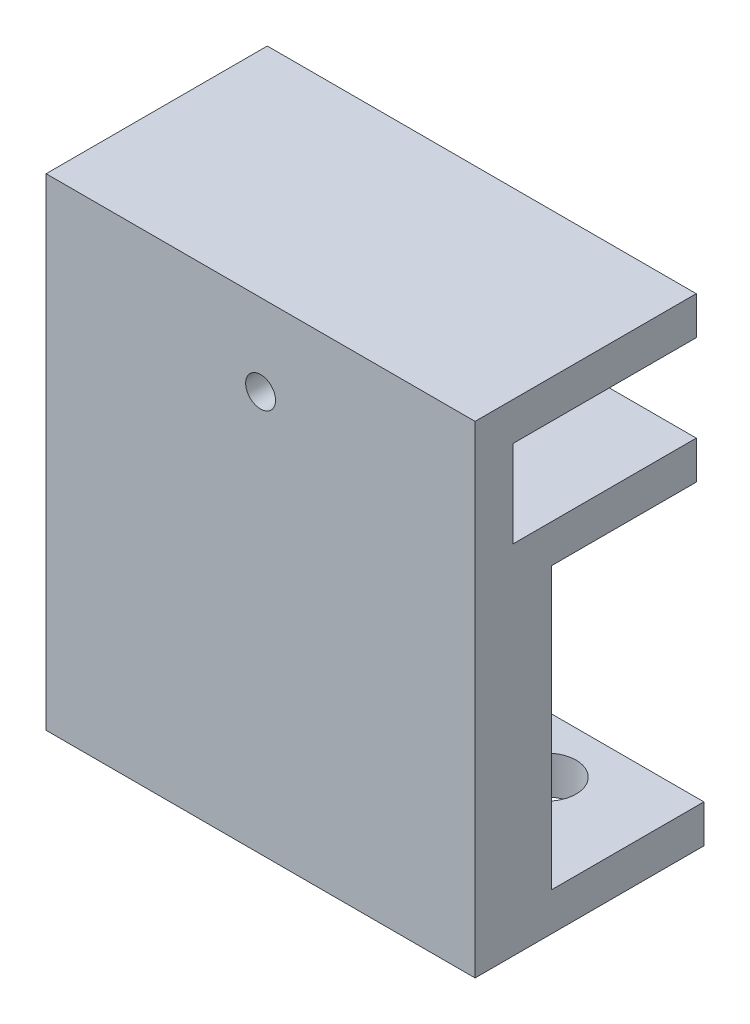
ISO-10303-21;
HEADER;
FILE_DESCRIPTION(('STEP AP214'),'2;1');
FILE_NAME('part.step','',(''),(''),'','','');
FILE_SCHEMA(('AUTOMOTIVE_DESIGN { 1 0 10303 214 1 1 1 1 }'));
ENDSEC;
DATA;
#1=APPLICATION_CONTEXT('core data for automotive mechanical design processes');
#2=APPLICATION_PROTOCOL_DEFINITION('international standard','automotive_design',2000,#1);
#3=PRODUCT_CONTEXT('',#1,'mechanical');
#4=PRODUCT('Part','Part','',(#3));
#5=PRODUCT_RELATED_PRODUCT_CATEGORY('part','',(#4));
#6=PRODUCT_DEFINITION_FORMATION('','',#4);
#7=PRODUCT_DEFINITION_CONTEXT('part definition',#1,'design');
#8=PRODUCT_DEFINITION('design','',#6,#7);
#9=PRODUCT_DEFINITION_SHAPE('','',#8);
#10=(LENGTH_UNIT() NAMED_UNIT(*) SI_UNIT(.MILLI.,.METRE.));
#11=(NAMED_UNIT(*) PLANE_ANGLE_UNIT() SI_UNIT($,.RADIAN.));
#12=(NAMED_UNIT(*) SI_UNIT($,.STERADIAN.) SOLID_ANGLE_UNIT());
#13=UNCERTAINTY_MEASURE_WITH_UNIT(LENGTH_MEASURE(1.E-05),#10,'distance_accuracy_value','');
#14=(GEOMETRIC_REPRESENTATION_CONTEXT(3) GLOBAL_UNCERTAINTY_ASSIGNED_CONTEXT((#13)) GLOBAL_UNIT_ASSIGNED_CONTEXT((#10,
#11,#12)) REPRESENTATION_CONTEXT('',''));
#15=CARTESIAN_POINT('',(0.,0.,0.));
#16=DIRECTION('',(0.,0.,1.));
#17=DIRECTION('',(1.,0.,0.));
#18=AXIS2_PLACEMENT_3D('',#15,#16,#17);
#19=CARTESIAN_POINT('',(35.7124,20.828,-24.13));
#20=DIRECTION('',(0.,0.,1.));
#21=DIRECTION('',(1.,0.,0.));
#22=AXIS2_PLACEMENT_3D('',#19,#20,#21);
#23=PLANE('',#22);
#24=DIRECTION('',(0.,1.,0.));
#25=VECTOR('',#24,1.);
#26=CARTESIAN_POINT('',(-35.7124,20.828,-24.13));
#27=LINE('',#26,#25);
#28=CARTESIAN_POINT('',(-35.7124,20.828,-24.13));
#29=VERTEX_POINT('',#28);
#30=CARTESIAN_POINT('',(-35.7124,27.178,-24.13));
#31=VERTEX_POINT('',#30);
#32=EDGE_CURVE('E164',#29,#31,#27,.T.);
#33=ORIENTED_EDGE('',*,*,#32,.T.);
#34=DIRECTION('',(-1.,0.,0.));
#35=VECTOR('',#34,1.);
#36=CARTESIAN_POINT('',(35.7124,27.178,-24.13));
#37=LINE('',#36,#35);
#38=CARTESIAN_POINT('',(35.7124,27.178,-24.13));
#39=VERTEX_POINT('',#38);
#40=EDGE_CURVE('E11',#39,#31,#37,.T.);
#41=ORIENTED_EDGE('',*,*,#40,.F.);
#42=DIRECTION('',(0.,1.,0.));
#43=VECTOR('',#42,1.);
#44=CARTESIAN_POINT('',(35.7124,20.828,-24.13));
#45=LINE('',#44,#43);
#46=CARTESIAN_POINT('',(35.7124,20.828,-24.13));
#47=VERTEX_POINT('',#46);
#48=EDGE_CURVE('E200',#47,#39,#45,.T.);
#49=ORIENTED_EDGE('',*,*,#48,.F.);
#50=DIRECTION('',(-1.,0.,0.));
#51=VECTOR('',#50,1.);
#52=CARTESIAN_POINT('',(35.7124,20.828,-24.13));
#53=LINE('',#52,#51);
#54=EDGE_CURVE('E160',#47,#29,#53,.T.);
#55=ORIENTED_EDGE('',*,*,#54,.T.);
#56=EDGE_LOOP('',(#33,#41,#49,#55));
#57=FACE_BOUND('',#56,.T.);
#58=ADVANCED_FACE('F39',(#57),#23,.F.);
#59=CARTESIAN_POINT('',(35.7124,27.178,-24.13));
#60=DIRECTION('',(0.,-1.,0.));
#61=DIRECTION('',(0.,0.,-1.));
#62=AXIS2_PLACEMENT_3D('',#59,#60,#61);
#63=PLANE('',#62);
#64=DIRECTION('',(0.,0.,1.));
#65=VECTOR('',#64,1.);
#66=CARTESIAN_POINT('',(-35.7124,27.178,-24.13));
#67=LINE('',#66,#65);
#68=CARTESIAN_POINT('',(-35.7124,27.178,12.7));
#69=VERTEX_POINT('',#68);
#70=EDGE_CURVE('E168',#31,#69,#67,.T.);
#71=ORIENTED_EDGE('',*,*,#70,.T.);
#72=DIRECTION('',(-1.,0.,0.));
#73=VECTOR('',#72,1.);
#74=CARTESIAN_POINT('',(35.7124,27.178,12.7));
#75=LINE('',#74,#73);
#76=CARTESIAN_POINT('',(35.7124,27.178,12.7));
#77=VERTEX_POINT('',#76);
#78=EDGE_CURVE('E48',#77,#69,#75,.T.);
#79=ORIENTED_EDGE('',*,*,#78,.F.);
#80=DIRECTION('',(0.,0.,1.));
#81=VECTOR('',#80,1.);
#82=CARTESIAN_POINT('',(35.7124,27.178,-24.13));
#83=LINE('',#82,#81);
#84=EDGE_CURVE('E111',#39,#77,#83,.T.);
#85=ORIENTED_EDGE('',*,*,#84,.F.);
#86=ORIENTED_EDGE('',*,*,#40,.T.);
#87=EDGE_LOOP('',(#71,#79,#85,#86));
#88=FACE_BOUND('',#87,.T.);
#89=ADVANCED_FACE('F237',(#88),#63,.F.);
#90=CARTESIAN_POINT('',(35.7124,0.,12.7));
#91=DIRECTION('',(0.,0.,-1.));
#92=DIRECTION('',(0.,1.,0.));
#93=AXIS2_PLACEMENT_3D('',#90,#91,#92);
#94=PLANE('',#93);
#95=CARTESIAN_POINT('',(0.,13.589,12.7));
#96=DIRECTION('',(0.,0.,1.));
#97=DIRECTION('',(1.,0.,0.));
#98=AXIS2_PLACEMENT_3D('',#95,#96,#97);
#99=CIRCLE('',#98,2.4892);
#100=CARTESIAN_POINT('',(2.4892,13.589,12.7));
#101=VERTEX_POINT('',#100);
#102=EDGE_CURVE('E413',#101,#101,#99,.T.);
#103=ORIENTED_EDGE('',*,*,#102,.F.);
#104=EDGE_LOOP('',(#103));
#105=FACE_BOUND('',#104,.T.);
#106=DIRECTION('',(0.,-1.,0.));
#107=VECTOR('',#106,1.);
#108=CARTESIAN_POINT('',(-35.7124,0.,12.7));
#109=LINE('',#108,#107);
#110=CARTESIAN_POINT('',(-35.7124,-53.086,12.7));
#111=VERTEX_POINT('',#110);
#112=EDGE_CURVE('E173',#69,#111,#109,.T.);
#113=ORIENTED_EDGE('',*,*,#112,.T.);
#114=DIRECTION('',(-1.,0.,0.));
#115=VECTOR('',#114,1.);
#116=CARTESIAN_POINT('',(35.7124,-53.086,12.7));
#117=LINE('',#116,#115);
#118=CARTESIAN_POINT('',(35.7124,-53.086,12.7));
#119=VERTEX_POINT('',#118);
#120=EDGE_CURVE('E227',#119,#111,#117,.T.);
#121=ORIENTED_EDGE('',*,*,#120,.F.);
#122=DIRECTION('',(0.,-1.,0.));
#123=VECTOR('',#122,1.);
#124=CARTESIAN_POINT('',(35.7124,0.,12.7));
#125=LINE('',#124,#123);
#126=EDGE_CURVE('E236',#77,#119,#125,.T.);
#127=ORIENTED_EDGE('',*,*,#126,.F.);
#128=ORIENTED_EDGE('',*,*,#78,.T.);
#129=EDGE_LOOP('',(#113,#121,#127,#128));
#130=FACE_BOUND('',#129,.T.);
#131=ADVANCED_FACE('F234',(#105,#130),#94,.F.);
#132=CARTESIAN_POINT('',(35.7124,-53.086,12.7));
#133=DIRECTION('',(0.,1.,0.));
#134=DIRECTION('',(0.,0.,1.));
#135=AXIS2_PLACEMENT_3D('',#132,#133,#134);
#136=PLANE('',#135);
#137=CARTESIAN_POINT('',(19.05,-53.086,-15.875));
#138=DIRECTION('',(0.,-1.,0.));
#139=DIRECTION('',(0.,0.,-1.));
#140=AXIS2_PLACEMENT_3D('',#137,#138,#139);
#141=CIRCLE('',#140,4.90219999999999);
#142=CARTESIAN_POINT('',(19.05,-53.086,-20.7772));
#143=VERTEX_POINT('',#142);
#144=EDGE_CURVE('E399',#143,#143,#141,.T.);
#145=ORIENTED_EDGE('',*,*,#144,.F.);
#146=EDGE_LOOP('',(#145));
#147=FACE_BOUND('',#146,.T.);
#148=CARTESIAN_POINT('',(-19.05,-53.086,-15.875));
#149=DIRECTION('',(0.,-1.,0.));
#150=DIRECTION('',(0.,0.,-1.));
#151=AXIS2_PLACEMENT_3D('',#148,#149,#150);
#152=CIRCLE('',#151,4.90219999999999);
#153=CARTESIAN_POINT('',(-19.05,-53.086,-20.7772));
#154=VERTEX_POINT('',#153);
#155=EDGE_CURVE('E403',#154,#154,#152,.T.);
#156=ORIENTED_EDGE('',*,*,#155,.F.);
#157=EDGE_LOOP('',(#156));
#158=FACE_BOUND('',#157,.T.);
#159=DIRECTION('',(0.,0.,-1.));
#160=VECTOR('',#159,1.);
#161=CARTESIAN_POINT('',(-35.7124,-53.086,12.7));
#162=LINE('',#161,#160);
#163=CARTESIAN_POINT('',(-35.7124,-53.086,-25.4));
#164=VERTEX_POINT('',#163);
#165=EDGE_CURVE('E176',#111,#164,#162,.T.);
#166=ORIENTED_EDGE('',*,*,#165,.T.);
#167=DIRECTION('',(-1.,0.,0.));
#168=VECTOR('',#167,1.);
#169=CARTESIAN_POINT('',(35.7124,-53.086,-25.4));
#170=LINE('',#169,#168);
#171=CARTESIAN_POINT('',(35.7124,-53.086,-25.4));
#172=VERTEX_POINT('',#171);
#173=EDGE_CURVE('E223',#172,#164,#170,.T.);
#174=ORIENTED_EDGE('',*,*,#173,.F.);
#175=DIRECTION('',(0.,0.,-1.));
#176=VECTOR('',#175,1.);
#177=CARTESIAN_POINT('',(35.7124,-53.086,12.7));
#178=LINE('',#177,#176);
#179=EDGE_CURVE('E257',#119,#172,#178,.T.);
#180=ORIENTED_EDGE('',*,*,#179,.F.);
#181=ORIENTED_EDGE('',*,*,#120,.T.);
#182=EDGE_LOOP('',(#166,#174,#180,#181));
#183=FACE_BOUND('',#182,.T.);
#184=ADVANCED_FACE('F247',(#147,#158,#183),#136,.F.);
#185=CARTESIAN_POINT('',(35.7124,-53.086,-25.4));
#186=DIRECTION('',(0.,0.,1.));
#187=DIRECTION('',(1.,0.,0.));
#188=AXIS2_PLACEMENT_3D('',#185,#186,#187);
#189=PLANE('',#188);
#190=DIRECTION('',(0.,1.,0.));
#191=VECTOR('',#190,1.);
#192=CARTESIAN_POINT('',(-35.7124,-53.086,-25.4));
#193=LINE('',#192,#191);
#194=CARTESIAN_POINT('',(-35.7124,-46.736,-25.4));
#195=VERTEX_POINT('',#194);
#196=EDGE_CURVE('E179',#164,#195,#193,.T.);
#197=ORIENTED_EDGE('',*,*,#196,.T.);
#198=DIRECTION('',(-1.,0.,0.));
#199=VECTOR('',#198,1.);
#200=CARTESIAN_POINT('',(35.7124,-46.736,-25.4));
#201=LINE('',#200,#199);
#202=CARTESIAN_POINT('',(35.7124,-46.736,-25.4));
#203=VERTEX_POINT('',#202);
#204=EDGE_CURVE('E219',#203,#195,#201,.T.);
#205=ORIENTED_EDGE('',*,*,#204,.F.);
#206=DIRECTION('',(0.,1.,0.));
#207=VECTOR('',#206,1.);
#208=CARTESIAN_POINT('',(35.7124,-53.086,-25.4));
#209=LINE('',#208,#207);
#210=EDGE_CURVE('E253',#172,#203,#209,.T.);
#211=ORIENTED_EDGE('',*,*,#210,.F.);
#212=ORIENTED_EDGE('',*,*,#173,.T.);
#213=EDGE_LOOP('',(#197,#205,#211,#212));
#214=FACE_BOUND('',#213,.T.);
#215=ADVANCED_FACE('F251',(#214),#189,.F.);
#216=CARTESIAN_POINT('',(35.7124,-46.736,-25.4));
#217=DIRECTION('',(0.,-1.,0.));
#218=DIRECTION('',(0.,0.,-1.));
#219=AXIS2_PLACEMENT_3D('',#216,#217,#218);
#220=PLANE('',#219);
#221=CARTESIAN_POINT('',(19.05,-46.736,-15.875));
#222=DIRECTION('',(0.,-1.,0.));
#223=DIRECTION('',(0.,0.,-1.));
#224=AXIS2_PLACEMENT_3D('',#221,#222,#223);
#225=CIRCLE('',#224,4.90219999999999);
#226=CARTESIAN_POINT('',(19.05,-46.736,-20.7772));
#227=VERTEX_POINT('',#226);
#228=EDGE_CURVE('E396',#227,#227,#225,.T.);
#229=ORIENTED_EDGE('',*,*,#228,.T.);
#230=EDGE_LOOP('',(#229));
#231=FACE_BOUND('',#230,.T.);
#232=CARTESIAN_POINT('',(-19.05,-46.736,-15.875));
#233=DIRECTION('',(0.,-1.,0.));
#234=DIRECTION('',(0.,0.,-1.));
#235=AXIS2_PLACEMENT_3D('',#232,#233,#234);
#236=CIRCLE('',#235,4.90219999999999);
#237=CARTESIAN_POINT('',(-19.05,-46.736,-20.7772));
#238=VERTEX_POINT('',#237);
#239=EDGE_CURVE('E409',#238,#238,#236,.T.);
#240=ORIENTED_EDGE('',*,*,#239,.T.);
#241=EDGE_LOOP('',(#240));
#242=FACE_BOUND('',#241,.T.);
#243=DIRECTION('',(0.,0.,1.));
#244=VECTOR('',#243,1.);
#245=CARTESIAN_POINT('',(-35.7124,-46.736,-25.4));
#246=LINE('',#245,#244);
#247=CARTESIAN_POINT('',(-35.7124,-46.736,0.));
#248=VERTEX_POINT('',#247);
#249=EDGE_CURVE('E182',#195,#248,#246,.T.);
#250=ORIENTED_EDGE('',*,*,#249,.T.);
#251=DIRECTION('',(-1.,0.,0.));
#252=VECTOR('',#251,1.);
#253=CARTESIAN_POINT('',(35.7124,-46.736,0.));
#254=LINE('',#253,#252);
#255=CARTESIAN_POINT('',(35.7124,-46.736,0.));
#256=VERTEX_POINT('',#255);
#257=EDGE_CURVE('E215',#256,#248,#254,.T.);
#258=ORIENTED_EDGE('',*,*,#257,.F.);
#259=DIRECTION('',(0.,0.,1.));
#260=VECTOR('',#259,1.);
#261=CARTESIAN_POINT('',(35.7124,-46.736,-25.4));
#262=LINE('',#261,#260);
#263=EDGE_CURVE('E256',#203,#256,#262,.T.);
#264=ORIENTED_EDGE('',*,*,#263,.F.);
#265=ORIENTED_EDGE('',*,*,#204,.T.);
#266=EDGE_LOOP('',(#250,#258,#264,#265));
#267=FACE_BOUND('',#266,.T.);
#268=ADVANCED_FACE('F286',(#231,#242,#267),#220,.F.);
#269=CARTESIAN_POINT('',(35.7124,-46.736,0.));
#270=DIRECTION('',(0.,0.,1.));
#271=DIRECTION('',(1.,0.,0.));
#272=AXIS2_PLACEMENT_3D('',#269,#270,#271);
#273=PLANE('',#272);
#274=DIRECTION('',(0.,1.,0.));
#275=VECTOR('',#274,1.);
#276=CARTESIAN_POINT('',(-35.7124,-46.736,0.));
#277=LINE('',#276,#275);
#278=CARTESIAN_POINT('',(-35.7124,0.,0.));
#279=VERTEX_POINT('',#278);
#280=EDGE_CURVE('E185',#248,#279,#277,.T.);
#281=ORIENTED_EDGE('',*,*,#280,.T.);
#282=DIRECTION('',(-1.,0.,0.));
#283=VECTOR('',#282,1.);
#284=CARTESIAN_POINT('',(35.7124,0.,0.));
#285=LINE('',#284,#283);
#286=CARTESIAN_POINT('',(35.7124,0.,0.));
#287=VERTEX_POINT('',#286);
#288=EDGE_CURVE('E211',#287,#279,#285,.T.);
#289=ORIENTED_EDGE('',*,*,#288,.F.);
#290=DIRECTION('',(0.,1.,0.));
#291=VECTOR('',#290,1.);
#292=CARTESIAN_POINT('',(35.7124,-46.736,0.));
#293=LINE('',#292,#291);
#294=EDGE_CURVE('E261',#256,#287,#293,.T.);
#295=ORIENTED_EDGE('',*,*,#294,.F.);
#296=ORIENTED_EDGE('',*,*,#257,.T.);
#297=EDGE_LOOP('',(#281,#289,#295,#296));
#298=FACE_BOUND('',#297,.T.);
#299=ADVANCED_FACE('F283',(#298),#273,.F.);
#300=CARTESIAN_POINT('',(35.7124,0.,0.));
#301=DIRECTION('',(0.,1.,0.));
#302=DIRECTION('',(0.,0.,1.));
#303=AXIS2_PLACEMENT_3D('',#300,#301,#302);
#304=PLANE('',#303);
#305=DIRECTION('',(0.,0.,-1.));
#306=VECTOR('',#305,1.);
#307=CARTESIAN_POINT('',(-35.7124,0.,0.));
#308=LINE('',#307,#306);
#309=CARTESIAN_POINT('',(-35.7124,0.,-24.13));
#310=VERTEX_POINT('',#309);
#311=EDGE_CURVE('E188',#279,#310,#308,.T.);
#312=ORIENTED_EDGE('',*,*,#311,.T.);
#313=DIRECTION('',(-1.,0.,0.));
#314=VECTOR('',#313,1.);
#315=CARTESIAN_POINT('',(35.7124,0.,-24.13));
#316=LINE('',#315,#314);
#317=CARTESIAN_POINT('',(35.7124,0.,-24.13));
#318=VERTEX_POINT('',#317);
#319=EDGE_CURVE('E207',#318,#310,#316,.T.);
#320=ORIENTED_EDGE('',*,*,#319,.F.);
#321=DIRECTION('',(0.,0.,-1.));
#322=VECTOR('',#321,1.);
#323=CARTESIAN_POINT('',(35.7124,0.,0.));
#324=LINE('',#323,#322);
#325=EDGE_CURVE('E268',#287,#318,#324,.T.);
#326=ORIENTED_EDGE('',*,*,#325,.F.);
#327=ORIENTED_EDGE('',*,*,#288,.T.);
#328=EDGE_LOOP('',(#312,#320,#326,#327));
#329=FACE_BOUND('',#328,.T.);
#330=ADVANCED_FACE('F276',(#329),#304,.F.);
#331=CARTESIAN_POINT('',(35.7124,0.,-24.13));
#332=DIRECTION('',(0.,0.,1.));
#333=DIRECTION('',(1.,0.,0.));
#334=AXIS2_PLACEMENT_3D('',#331,#332,#333);
#335=PLANE('',#334);
#336=DIRECTION('',(0.,1.,0.));
#337=VECTOR('',#336,1.);
#338=CARTESIAN_POINT('',(-35.7124,0.,-24.13));
#339=LINE('',#338,#337);
#340=CARTESIAN_POINT('',(-35.7124,6.35000000000001,-24.13));
#341=VERTEX_POINT('',#340);
#342=EDGE_CURVE('E191',#310,#341,#339,.T.);
#343=ORIENTED_EDGE('',*,*,#342,.T.);
#344=DIRECTION('',(-1.,0.,0.));
#345=VECTOR('',#344,1.);
#346=CARTESIAN_POINT('',(35.7124,6.35000000000001,-24.13));
#347=LINE('',#346,#345);
#348=CARTESIAN_POINT('',(35.7124,6.35000000000001,-24.13));
#349=VERTEX_POINT('',#348);
#350=EDGE_CURVE('E153',#349,#341,#347,.T.);
#351=ORIENTED_EDGE('',*,*,#350,.F.);
#352=DIRECTION('',(0.,1.,0.));
#353=VECTOR('',#352,1.);
#354=CARTESIAN_POINT('',(35.7124,0.,-24.13));
#355=LINE('',#354,#353);
#356=EDGE_CURVE('E142',#318,#349,#355,.T.);
#357=ORIENTED_EDGE('',*,*,#356,.F.);
#358=ORIENTED_EDGE('',*,*,#319,.T.);
#359=EDGE_LOOP('',(#343,#351,#357,#358));
#360=FACE_BOUND('',#359,.T.);
#361=ADVANCED_FACE('F280',(#360),#335,.F.);
#362=CARTESIAN_POINT('',(35.7124,6.35000000000001,-24.13));
#363=DIRECTION('',(0.,-1.,0.));
#364=DIRECTION('',(0.,0.,-1.));
#365=AXIS2_PLACEMENT_3D('',#362,#363,#364);
#366=PLANE('',#365);
#367=DIRECTION('',(0.,0.,1.));
#368=VECTOR('',#367,1.);
#369=CARTESIAN_POINT('',(-35.7124,6.35000000000001,-24.13));
#370=LINE('',#369,#368);
#371=CARTESIAN_POINT('',(-35.7124,6.35,6.35));
#372=VERTEX_POINT('',#371);
#373=EDGE_CURVE('E151',#341,#372,#370,.T.);
#374=ORIENTED_EDGE('',*,*,#373,.T.);
#375=DIRECTION('',(-1.,0.,0.));
#376=VECTOR('',#375,1.);
#377=CARTESIAN_POINT('',(35.7124,6.35,6.35));
#378=LINE('',#377,#376);
#379=CARTESIAN_POINT('',(35.7124,6.35,6.35));
#380=VERTEX_POINT('',#379);
#381=EDGE_CURVE('E148',#380,#372,#378,.T.);
#382=ORIENTED_EDGE('',*,*,#381,.F.);
#383=DIRECTION('',(0.,0.,1.));
#384=VECTOR('',#383,1.);
#385=CARTESIAN_POINT('',(35.7124,6.35000000000001,-24.13));
#386=LINE('',#385,#384);
#387=EDGE_CURVE('E136',#349,#380,#386,.T.);
#388=ORIENTED_EDGE('',*,*,#387,.F.);
#389=ORIENTED_EDGE('',*,*,#350,.T.);
#390=EDGE_LOOP('',(#374,#382,#388,#389));
#391=FACE_BOUND('',#390,.T.);
#392=ADVANCED_FACE('F149',(#391),#366,.F.);
#393=CARTESIAN_POINT('',(35.7124,6.35,6.35));
#394=DIRECTION('',(0.,0.,1.));
#395=DIRECTION('',(1.,0.,0.));
#396=AXIS2_PLACEMENT_3D('',#393,#394,#395);
#397=PLANE('',#396);
#398=CARTESIAN_POINT('',(0.,13.589,6.35));
#399=DIRECTION('',(0.,0.,1.));
#400=DIRECTION('',(1.,0.,0.));
#401=AXIS2_PLACEMENT_3D('',#398,#399,#400);
#402=CIRCLE('',#401,2.4892);
#403=CARTESIAN_POINT('',(2.4892,13.589,6.35));
#404=VERTEX_POINT('',#403);
#405=EDGE_CURVE('E169',#404,#404,#402,.T.);
#406=ORIENTED_EDGE('',*,*,#405,.T.);
#407=EDGE_LOOP('',(#406));
#408=FACE_BOUND('',#407,.T.);
#409=DIRECTION('',(0.,1.,0.));
#410=VECTOR('',#409,1.);
#411=CARTESIAN_POINT('',(-35.7124,6.35,6.35));
#412=LINE('',#411,#410);
#413=CARTESIAN_POINT('',(-35.7124,20.828,6.35));
#414=VERTEX_POINT('',#413);
#415=EDGE_CURVE('E97',#372,#414,#412,.T.);
#416=ORIENTED_EDGE('',*,*,#415,.T.);
#417=DIRECTION('',(-1.,0.,0.));
#418=VECTOR('',#417,1.);
#419=CARTESIAN_POINT('',(35.7124,20.828,6.35));
#420=LINE('',#419,#418);
#421=CARTESIAN_POINT('',(35.7124,20.828,6.35));
#422=VERTEX_POINT('',#421);
#423=EDGE_CURVE('E154',#422,#414,#420,.T.);
#424=ORIENTED_EDGE('',*,*,#423,.F.);
#425=DIRECTION('',(0.,1.,0.));
#426=VECTOR('',#425,1.);
#427=CARTESIAN_POINT('',(35.7124,6.35,6.35));
#428=LINE('',#427,#426);
#429=EDGE_CURVE('E140',#380,#422,#428,.T.);
#430=ORIENTED_EDGE('',*,*,#429,.F.);
#431=ORIENTED_EDGE('',*,*,#381,.T.);
#432=EDGE_LOOP('',(#416,#424,#430,#431));
#433=FACE_BOUND('',#432,.T.);
#434=ADVANCED_FACE('F156',(#408,#433),#397,.F.);
#435=CARTESIAN_POINT('',(35.7124,20.828,6.35));
#436=DIRECTION('',(0.,1.,0.));
#437=DIRECTION('',(0.,0.,1.));
#438=AXIS2_PLACEMENT_3D('',#435,#436,#437);
#439=PLANE('',#438);
#440=DIRECTION('',(0.,0.,-1.));
#441=VECTOR('',#440,1.);
#442=CARTESIAN_POINT('',(-35.7124,20.828,6.35));
#443=LINE('',#442,#441);
#444=EDGE_CURVE('E103',#414,#29,#443,.T.);
#445=ORIENTED_EDGE('',*,*,#444,.T.);
#446=ORIENTED_EDGE('',*,*,#54,.F.);
#447=DIRECTION('',(0.,0.,-1.));
#448=VECTOR('',#447,1.);
#449=CARTESIAN_POINT('',(35.7124,20.828,6.35));
#450=LINE('',#449,#448);
#451=EDGE_CURVE('E56',#422,#47,#450,.T.);
#452=ORIENTED_EDGE('',*,*,#451,.F.);
#453=ORIENTED_EDGE('',*,*,#423,.T.);
#454=EDGE_LOOP('',(#445,#446,#452,#453));
#455=FACE_BOUND('',#454,.T.);
#456=ADVANCED_FACE('F304',(#455),#439,.F.);
#457=CARTESIAN_POINT('',(35.7124,0.,0.));
#458=DIRECTION('',(1.,0.,0.));
#459=DIRECTION('',(0.,0.,-1.));
#460=AXIS2_PLACEMENT_3D('',#457,#458,#459);
#461=PLANE('',#460);
#462=ORIENTED_EDGE('',*,*,#48,.T.);
#463=ORIENTED_EDGE('',*,*,#84,.T.);
#464=ORIENTED_EDGE('',*,*,#126,.T.);
#465=ORIENTED_EDGE('',*,*,#179,.T.);
#466=ORIENTED_EDGE('',*,*,#210,.T.);
#467=ORIENTED_EDGE('',*,*,#263,.T.);
#468=ORIENTED_EDGE('',*,*,#294,.T.);
#469=ORIENTED_EDGE('',*,*,#325,.T.);
#470=ORIENTED_EDGE('',*,*,#356,.T.);
#471=ORIENTED_EDGE('',*,*,#387,.T.);
#472=ORIENTED_EDGE('',*,*,#429,.T.);
#473=ORIENTED_EDGE('',*,*,#451,.T.);
#474=EDGE_LOOP('',(#462,#463,#464,#465,#466,#467,#468,#469,#470,#471,#472,#473));
#475=FACE_BOUND('',#474,.T.);
#476=ADVANCED_FACE('F138',(#475),#461,.T.);
#477=CARTESIAN_POINT('',(-35.7124,0.,0.));
#478=DIRECTION('',(1.,0.,0.));
#479=DIRECTION('',(0.,0.,-1.));
#480=AXIS2_PLACEMENT_3D('',#477,#478,#479);
#481=PLANE('',#480);
#482=ORIENTED_EDGE('',*,*,#32,.F.);
#483=ORIENTED_EDGE('',*,*,#444,.F.);
#484=ORIENTED_EDGE('',*,*,#415,.F.);
#485=ORIENTED_EDGE('',*,*,#373,.F.);
#486=ORIENTED_EDGE('',*,*,#342,.F.);
#487=ORIENTED_EDGE('',*,*,#311,.F.);
#488=ORIENTED_EDGE('',*,*,#280,.F.);
#489=ORIENTED_EDGE('',*,*,#249,.F.);
#490=ORIENTED_EDGE('',*,*,#196,.F.);
#491=ORIENTED_EDGE('',*,*,#165,.F.);
#492=ORIENTED_EDGE('',*,*,#112,.F.);
#493=ORIENTED_EDGE('',*,*,#70,.F.);
#494=EDGE_LOOP('',(#482,#483,#484,#485,#486,#487,#488,#489,#490,#491,#492,#493));
#495=FACE_BOUND('',#494,.T.);
#496=ADVANCED_FACE('F241',(#495),#481,.F.);
#497=CARTESIAN_POINT('',(0.,13.589,12.7));
#498=DIRECTION('',(0.,0.,1.));
#499=DIRECTION('',(1.,0.,0.));
#500=AXIS2_PLACEMENT_3D('',#497,#498,#499);
#501=CYLINDRICAL_SURFACE('',#500,2.4892);
#502=ORIENTED_EDGE('',*,*,#102,.T.);
#503=EDGE_LOOP('',(#502));
#504=FACE_BOUND('',#503,.T.);
#505=ORIENTED_EDGE('',*,*,#405,.F.);
#506=EDGE_LOOP('',(#505));
#507=FACE_BOUND('',#506,.T.);
#508=ADVANCED_FACE('F348',(#504,#507),#501,.F.);
#509=CARTESIAN_POINT('',(-19.05,-53.086,-15.875));
#510=DIRECTION('',(0.,-1.,0.));
#511=DIRECTION('',(0.,0.,-1.));
#512=AXIS2_PLACEMENT_3D('',#509,#510,#511);
#513=CYLINDRICAL_SURFACE('',#512,4.90219999999999);
#514=ORIENTED_EDGE('',*,*,#239,.F.);
#515=EDGE_LOOP('',(#514));
#516=FACE_BOUND('',#515,.T.);
#517=ORIENTED_EDGE('',*,*,#155,.T.);
#518=EDGE_LOOP('',(#517));
#519=FACE_BOUND('',#518,.T.);
#520=ADVANCED_FACE('F353',(#516,#519),#513,.F.);
#521=CARTESIAN_POINT('',(19.05,-53.086,-15.875));
#522=DIRECTION('',(0.,-1.,0.));
#523=DIRECTION('',(0.,0.,-1.));
#524=AXIS2_PLACEMENT_3D('',#521,#522,#523);
#525=CYLINDRICAL_SURFACE('',#524,4.90219999999999);
#526=ORIENTED_EDGE('',*,*,#228,.F.);
#527=EDGE_LOOP('',(#526));
#528=FACE_BOUND('',#527,.T.);
#529=ORIENTED_EDGE('',*,*,#144,.T.);
#530=EDGE_LOOP('',(#529));
#531=FACE_BOUND('',#530,.T.);
#532=ADVANCED_FACE('F380',(#528,#531),#525,.F.);
#533=CLOSED_SHELL('',(#58,#89,#131,#184,#215,#268,#299,#330,#361,#392,#434,#456,#476,#496,#508,
#520,#532));
#534=MANIFOLD_SOLID_BREP('B2',#533);
#535=ADVANCED_BREP_SHAPE_REPRESENTATION('',(#18,#534),#14);
#536=SHAPE_DEFINITION_REPRESENTATION(#9,#535);
ENDSEC;
END-ISO-10303-21;
